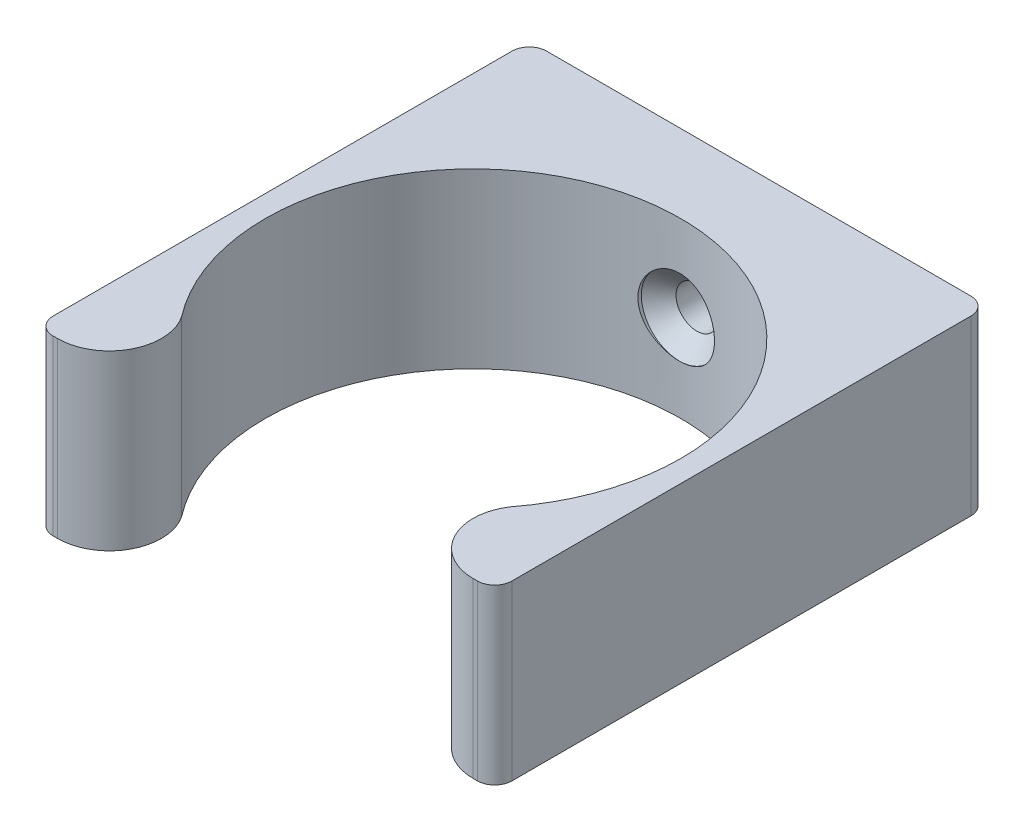
ISO-10303-21;
HEADER;
FILE_DESCRIPTION(('STEP AP214'),'2;1');
FILE_NAME('part.step','',(''),(''),'','','');
FILE_SCHEMA(('AUTOMOTIVE_DESIGN { 1 0 10303 214 1 1 1 1 }'));
ENDSEC;
DATA;
#1=APPLICATION_CONTEXT('core data for automotive mechanical design processes');
#2=APPLICATION_PROTOCOL_DEFINITION('international standard','automotive_design',2000,#1);
#3=PRODUCT_CONTEXT('',#1,'mechanical');
#4=PRODUCT('Part','Part','',(#3));
#5=PRODUCT_RELATED_PRODUCT_CATEGORY('part','',(#4));
#6=PRODUCT_DEFINITION_FORMATION('','',#4);
#7=PRODUCT_DEFINITION_CONTEXT('part definition',#1,'design');
#8=PRODUCT_DEFINITION('design','',#6,#7);
#9=PRODUCT_DEFINITION_SHAPE('','',#8);
#10=(LENGTH_UNIT() NAMED_UNIT(*) SI_UNIT(.MILLI.,.METRE.));
#11=(NAMED_UNIT(*) PLANE_ANGLE_UNIT() SI_UNIT($,.RADIAN.));
#12=(NAMED_UNIT(*) SI_UNIT($,.STERADIAN.) SOLID_ANGLE_UNIT());
#13=UNCERTAINTY_MEASURE_WITH_UNIT(LENGTH_MEASURE(1.E-05),#10,'distance_accuracy_value','');
#14=(GEOMETRIC_REPRESENTATION_CONTEXT(3) GLOBAL_UNCERTAINTY_ASSIGNED_CONTEXT((#13)) GLOBAL_UNIT_ASSIGNED_CONTEXT((#10,
#11,#12)) REPRESENTATION_CONTEXT('',''));
#15=CARTESIAN_POINT('',(0.,0.,0.));
#16=DIRECTION('',(0.,0.,1.));
#17=DIRECTION('',(1.,0.,0.));
#18=AXIS2_PLACEMENT_3D('',#15,#16,#17);
#19=CARTESIAN_POINT('',(12.,10.,8.99688248633757));
#20=DIRECTION('',(0.,-1.,0.));
#21=DIRECTION('',(0.,0.,-1.));
#22=AXIS2_PLACEMENT_3D('',#19,#20,#21);
#23=CYLINDRICAL_SURFACE('',#22,3.00311751366243);
#24=CARTESIAN_POINT('',(12.,0.,8.99688248633757));
#25=DIRECTION('',(0.,-1.,0.));
#26=DIRECTION('',(0.,0.,-1.));
#27=AXIS2_PLACEMENT_3D('',#24,#25,#26);
#28=CIRCLE('',#27,3.00311751366243);
#29=CARTESIAN_POINT('',(12.,0.,12.));
#30=VERTEX_POINT('',#29);
#31=CARTESIAN_POINT('',(9.5075675424474,0.,7.32162273173105));
#32=VERTEX_POINT('',#31);
#33=EDGE_CURVE('E156',#30,#32,#28,.T.);
#34=ORIENTED_EDGE('',*,*,#33,.F.);
#35=DIRECTION('',(0.,-1.,0.));
#36=VECTOR('',#35,1.);
#37=CARTESIAN_POINT('',(12.,10.,12.));
#38=LINE('',#37,#36);
#39=CARTESIAN_POINT('',(12.,10.,12.));
#40=VERTEX_POINT('',#39);
#41=EDGE_CURVE('E11',#40,#30,#38,.T.);
#42=ORIENTED_EDGE('',*,*,#41,.F.);
#43=CARTESIAN_POINT('',(12.,10.,8.99688248633757));
#44=DIRECTION('',(0.,-1.,0.));
#45=DIRECTION('',(0.,0.,-1.));
#46=AXIS2_PLACEMENT_3D('',#43,#44,#45);
#47=CIRCLE('',#46,3.00311751366243);
#48=CARTESIAN_POINT('',(9.5075675424474,10.,7.32162273173105));
#49=VERTEX_POINT('',#48);
#50=EDGE_CURVE('E188',#40,#49,#47,.T.);
#51=ORIENTED_EDGE('',*,*,#50,.T.);
#52=DIRECTION('',(0.,-1.,0.));
#53=VECTOR('',#52,1.);
#54=CARTESIAN_POINT('',(9.5075675424474,10.,7.32162273173105));
#55=LINE('',#54,#53);
#56=EDGE_CURVE('E102',#49,#32,#55,.T.);
#57=ORIENTED_EDGE('',*,*,#56,.T.);
#58=EDGE_LOOP('',(#34,#42,#51,#57));
#59=FACE_BOUND('',#58,.T.);
#60=ADVANCED_FACE('F33',(#59),#23,.T.);
#61=CARTESIAN_POINT('',(12.25,10.,12.));
#62=DIRECTION('',(0.,0.,1.));
#63=DIRECTION('',(1.,0.,0.));
#64=AXIS2_PLACEMENT_3D('',#61,#62,#63);
#65=PLANE('',#64);
#66=DIRECTION('',(-1.,0.,0.));
#67=VECTOR('',#66,1.);
#68=CARTESIAN_POINT('',(12.25,0.,12.));
#69=LINE('',#68,#67);
#70=CARTESIAN_POINT('',(12.25,0.,12.));
#71=VERTEX_POINT('',#70);
#72=EDGE_CURVE('E186',#71,#30,#69,.T.);
#73=ORIENTED_EDGE('',*,*,#72,.F.);
#74=DIRECTION('',(0.,-1.,0.));
#75=VECTOR('',#74,1.);
#76=CARTESIAN_POINT('',(12.25,10.,12.));
#77=LINE('',#76,#75);
#78=CARTESIAN_POINT('',(12.25,10.,12.));
#79=VERTEX_POINT('',#78);
#80=EDGE_CURVE('E42',#79,#71,#77,.T.);
#81=ORIENTED_EDGE('',*,*,#80,.F.);
#82=DIRECTION('',(-1.,0.,0.));
#83=VECTOR('',#82,1.);
#84=CARTESIAN_POINT('',(12.25,10.,12.));
#85=LINE('',#84,#83);
#86=EDGE_CURVE('E151',#79,#40,#85,.T.);
#87=ORIENTED_EDGE('',*,*,#86,.T.);
#88=ORIENTED_EDGE('',*,*,#41,.T.);
#89=EDGE_LOOP('',(#73,#81,#87,#88));
#90=FACE_BOUND('',#89,.T.);
#91=ADVANCED_FACE('F211',(#90),#65,.T.);
#92=CARTESIAN_POINT('',(12.25,10.,11.));
#93=DIRECTION('',(0.,-1.,0.));
#94=DIRECTION('',(0.,0.,-1.));
#95=AXIS2_PLACEMENT_3D('',#92,#93,#94);
#96=CYLINDRICAL_SURFACE('',#95,0.999999999999999);
#97=CARTESIAN_POINT('',(12.25,0.,11.));
#98=DIRECTION('',(0.,-1.,0.));
#99=DIRECTION('',(0.,0.,-1.));
#100=AXIS2_PLACEMENT_3D('',#97,#98,#99);
#101=CIRCLE('',#100,0.999999999999999);
#102=CARTESIAN_POINT('',(13.25,0.,11.));
#103=VERTEX_POINT('',#102);
#104=EDGE_CURVE('E136',#103,#71,#101,.T.);
#105=ORIENTED_EDGE('',*,*,#104,.F.);
#106=DIRECTION('',(0.,-1.,0.));
#107=VECTOR('',#106,1.);
#108=CARTESIAN_POINT('',(13.25,10.,11.));
#109=LINE('',#108,#107);
#110=CARTESIAN_POINT('',(13.25,10.,11.));
#111=VERTEX_POINT('',#110);
#112=EDGE_CURVE('E130',#111,#103,#109,.T.);
#113=ORIENTED_EDGE('',*,*,#112,.F.);
#114=CARTESIAN_POINT('',(12.25,10.,11.));
#115=DIRECTION('',(0.,-1.,0.));
#116=DIRECTION('',(0.,0.,-1.));
#117=AXIS2_PLACEMENT_3D('',#114,#115,#116);
#118=CIRCLE('',#117,0.999999999999999);
#119=EDGE_CURVE('E134',#111,#79,#118,.T.);
#120=ORIENTED_EDGE('',*,*,#119,.T.);
#121=ORIENTED_EDGE('',*,*,#80,.T.);
#122=EDGE_LOOP('',(#105,#113,#120,#121));
#123=FACE_BOUND('',#122,.T.);
#124=ADVANCED_FACE('F132',(#123),#96,.T.);
#125=CARTESIAN_POINT('',(13.25,10.,11.));
#126=DIRECTION('',(-1.,0.,0.));
#127=DIRECTION('',(0.,0.,1.));
#128=AXIS2_PLACEMENT_3D('',#125,#126,#127);
#129=PLANE('',#128);
#130=DIRECTION('',(0.,0.,-1.));
#131=VECTOR('',#130,1.);
#132=CARTESIAN_POINT('',(13.25,0.,11.));
#133=LINE('',#132,#131);
#134=CARTESIAN_POINT('',(13.25,0.,-15.5));
#135=VERTEX_POINT('',#134);
#136=EDGE_CURVE('E183',#103,#135,#133,.T.);
#137=ORIENTED_EDGE('',*,*,#136,.T.);
#138=DIRECTION('',(0.,-1.,0.));
#139=VECTOR('',#138,1.);
#140=CARTESIAN_POINT('',(13.25,10.,-15.5));
#141=LINE('',#140,#139);
#142=CARTESIAN_POINT('',(13.25,10.,-15.5));
#143=VERTEX_POINT('',#142);
#144=EDGE_CURVE('E140',#143,#135,#141,.T.);
#145=ORIENTED_EDGE('',*,*,#144,.F.);
#146=DIRECTION('',(0.,0.,-1.));
#147=VECTOR('',#146,1.);
#148=CARTESIAN_POINT('',(13.25,10.,11.));
#149=LINE('',#148,#147);
#150=EDGE_CURVE('E143',#111,#143,#149,.T.);
#151=ORIENTED_EDGE('',*,*,#150,.F.);
#152=ORIENTED_EDGE('',*,*,#112,.T.);
#153=EDGE_LOOP('',(#137,#145,#151,#152));
#154=FACE_BOUND('',#153,.T.);
#155=ADVANCED_FACE('F144',(#154),#129,.F.);
#156=CARTESIAN_POINT('',(12.25,10.,-15.5));
#157=DIRECTION('',(0.,-1.,0.));
#158=DIRECTION('',(0.,0.,-1.));
#159=AXIS2_PLACEMENT_3D('',#156,#157,#158);
#160=CYLINDRICAL_SURFACE('',#159,1.);
#161=CARTESIAN_POINT('',(12.25,0.,-15.5));
#162=DIRECTION('',(0.,-1.,0.));
#163=DIRECTION('',(0.,0.,-1.));
#164=AXIS2_PLACEMENT_3D('',#161,#162,#163);
#165=CIRCLE('',#164,1.);
#166=CARTESIAN_POINT('',(12.25,0.,-16.5));
#167=VERTEX_POINT('',#166);
#168=EDGE_CURVE('E180',#167,#135,#165,.T.);
#169=ORIENTED_EDGE('',*,*,#168,.F.);
#170=DIRECTION('',(0.,-1.,0.));
#171=VECTOR('',#170,1.);
#172=CARTESIAN_POINT('',(12.25,10.,-16.5));
#173=LINE('',#172,#171);
#174=CARTESIAN_POINT('',(12.25,10.,-16.5));
#175=VERTEX_POINT('',#174);
#176=EDGE_CURVE('E192',#175,#167,#173,.T.);
#177=ORIENTED_EDGE('',*,*,#176,.F.);
#178=CARTESIAN_POINT('',(12.25,10.,-15.5));
#179=DIRECTION('',(0.,-1.,0.));
#180=DIRECTION('',(0.,0.,-1.));
#181=AXIS2_PLACEMENT_3D('',#178,#179,#180);
#182=CIRCLE('',#181,1.);
#183=EDGE_CURVE('E148',#175,#143,#182,.T.);
#184=ORIENTED_EDGE('',*,*,#183,.T.);
#185=ORIENTED_EDGE('',*,*,#144,.T.);
#186=EDGE_LOOP('',(#169,#177,#184,#185));
#187=FACE_BOUND('',#186,.T.);
#188=ADVANCED_FACE('F224',(#187),#160,.T.);
#189=CARTESIAN_POINT('',(12.25,10.,-16.5));
#190=DIRECTION('',(0.,0.,1.));
#191=DIRECTION('',(1.,0.,0.));
#192=AXIS2_PLACEMENT_3D('',#189,#190,#191);
#193=PLANE('',#192);
#194=CARTESIAN_POINT('',(-0.0908605804392922,5.03144543899481,-16.5));
#195=DIRECTION('',(0.,0.,1.));
#196=DIRECTION('',(1.,0.,0.));
#197=AXIS2_PLACEMENT_3D('',#194,#195,#196);
#198=ELLIPSE('',#197,1.2000181941212,1.2);
#199=CARTESIAN_POINT('',(1.1091576136819,5.03144543899481,-16.5));
#200=VERTEX_POINT('',#199);
#201=EDGE_CURVE('E36',#200,#200,#198,.T.);
#202=ORIENTED_EDGE('',*,*,#201,.T.);
#203=EDGE_LOOP('',(#202));
#204=FACE_BOUND('',#203,.T.);
#205=DIRECTION('',(-1.,0.,0.));
#206=VECTOR('',#205,1.);
#207=CARTESIAN_POINT('',(12.25,0.,-16.5));
#208=LINE('',#207,#206);
#209=CARTESIAN_POINT('',(-12.25,0.,-16.5));
#210=VERTEX_POINT('',#209);
#211=EDGE_CURVE('E178',#167,#210,#208,.T.);
#212=ORIENTED_EDGE('',*,*,#211,.T.);
#213=DIRECTION('',(0.,-1.,0.));
#214=VECTOR('',#213,1.);
#215=CARTESIAN_POINT('',(-12.25,10.,-16.5));
#216=LINE('',#215,#214);
#217=CARTESIAN_POINT('',(-12.25,10.,-16.5));
#218=VERTEX_POINT('',#217);
#219=EDGE_CURVE('E194',#218,#210,#216,.T.);
#220=ORIENTED_EDGE('',*,*,#219,.F.);
#221=DIRECTION('',(-1.,0.,0.));
#222=VECTOR('',#221,1.);
#223=CARTESIAN_POINT('',(12.25,10.,-16.5));
#224=LINE('',#223,#222);
#225=EDGE_CURVE('E424',#175,#218,#224,.T.);
#226=ORIENTED_EDGE('',*,*,#225,.F.);
#227=ORIENTED_EDGE('',*,*,#176,.T.);
#228=EDGE_LOOP('',(#212,#220,#226,#227));
#229=FACE_BOUND('',#228,.T.);
#230=ADVANCED_FACE('F227',(#204,#229),#193,.F.);
#231=CARTESIAN_POINT('',(-12.25,10.,-15.5));
#232=DIRECTION('',(0.,-1.,0.));
#233=DIRECTION('',(0.,0.,-1.));
#234=AXIS2_PLACEMENT_3D('',#231,#232,#233);
#235=CYLINDRICAL_SURFACE('',#234,1.);
#236=CARTESIAN_POINT('',(-12.25,0.,-15.5));
#237=DIRECTION('',(0.,1.,0.));
#238=DIRECTION('',(0.,0.,1.));
#239=AXIS2_PLACEMENT_3D('',#236,#237,#238);
#240=CIRCLE('',#239,1.);
#241=CARTESIAN_POINT('',(-13.25,0.,-15.5));
#242=VERTEX_POINT('',#241);
#243=EDGE_CURVE('E175',#210,#242,#240,.T.);
#244=ORIENTED_EDGE('',*,*,#243,.T.);
#245=DIRECTION('',(0.,-1.,0.));
#246=VECTOR('',#245,1.);
#247=CARTESIAN_POINT('',(-13.25,10.,-15.5));
#248=LINE('',#247,#246);
#249=CARTESIAN_POINT('',(-13.25,10.,-15.5));
#250=VERTEX_POINT('',#249);
#251=EDGE_CURVE('E197',#250,#242,#248,.T.);
#252=ORIENTED_EDGE('',*,*,#251,.F.);
#253=CARTESIAN_POINT('',(-12.25,10.,-15.5));
#254=DIRECTION('',(0.,1.,0.));
#255=DIRECTION('',(0.,0.,1.));
#256=AXIS2_PLACEMENT_3D('',#253,#254,#255);
#257=CIRCLE('',#256,1.);
#258=EDGE_CURVE('E415',#218,#250,#257,.T.);
#259=ORIENTED_EDGE('',*,*,#258,.F.);
#260=ORIENTED_EDGE('',*,*,#219,.T.);
#261=EDGE_LOOP('',(#244,#252,#259,#260));
#262=FACE_BOUND('',#261,.T.);
#263=ADVANCED_FACE('F231',(#262),#235,.T.);
#264=CARTESIAN_POINT('',(-13.25,10.,11.));
#265=DIRECTION('',(-1.,0.,0.));
#266=DIRECTION('',(0.,0.,1.));
#267=AXIS2_PLACEMENT_3D('',#264,#265,#266);
#268=PLANE('',#267);
#269=DIRECTION('',(0.,0.,-1.));
#270=VECTOR('',#269,1.);
#271=CARTESIAN_POINT('',(-13.25,0.,11.));
#272=LINE('',#271,#270);
#273=CARTESIAN_POINT('',(-13.25,0.,11.));
#274=VERTEX_POINT('',#273);
#275=EDGE_CURVE('E172',#274,#242,#272,.T.);
#276=ORIENTED_EDGE('',*,*,#275,.F.);
#277=DIRECTION('',(0.,-1.,0.));
#278=VECTOR('',#277,1.);
#279=CARTESIAN_POINT('',(-13.25,10.,11.));
#280=LINE('',#279,#278);
#281=CARTESIAN_POINT('',(-13.25,10.,11.));
#282=VERTEX_POINT('',#281);
#283=EDGE_CURVE('E199',#282,#274,#280,.T.);
#284=ORIENTED_EDGE('',*,*,#283,.F.);
#285=DIRECTION('',(0.,0.,-1.));
#286=VECTOR('',#285,1.);
#287=CARTESIAN_POINT('',(-13.25,10.,11.));
#288=LINE('',#287,#286);
#289=EDGE_CURVE('E421',#282,#250,#288,.T.);
#290=ORIENTED_EDGE('',*,*,#289,.T.);
#291=ORIENTED_EDGE('',*,*,#251,.T.);
#292=EDGE_LOOP('',(#276,#284,#290,#291));
#293=FACE_BOUND('',#292,.T.);
#294=ADVANCED_FACE('F235',(#293),#268,.T.);
#295=CARTESIAN_POINT('',(-12.25,10.,11.));
#296=DIRECTION('',(0.,-1.,0.));
#297=DIRECTION('',(0.,0.,-1.));
#298=AXIS2_PLACEMENT_3D('',#295,#296,#297);
#299=CYLINDRICAL_SURFACE('',#298,0.999999999999999);
#300=CARTESIAN_POINT('',(-12.25,0.,11.));
#301=DIRECTION('',(0.,1.,0.));
#302=DIRECTION('',(0.,0.,1.));
#303=AXIS2_PLACEMENT_3D('',#300,#301,#302);
#304=CIRCLE('',#303,0.999999999999999);
#305=CARTESIAN_POINT('',(-12.25,0.,12.));
#306=VERTEX_POINT('',#305);
#307=EDGE_CURVE('E169',#274,#306,#304,.T.);
#308=ORIENTED_EDGE('',*,*,#307,.T.);
#309=DIRECTION('',(0.,-1.,0.));
#310=VECTOR('',#309,1.);
#311=CARTESIAN_POINT('',(-12.25,10.,12.));
#312=LINE('',#311,#310);
#313=CARTESIAN_POINT('',(-12.25,10.,12.));
#314=VERTEX_POINT('',#313);
#315=EDGE_CURVE('E201',#314,#306,#312,.T.);
#316=ORIENTED_EDGE('',*,*,#315,.F.);
#317=CARTESIAN_POINT('',(-12.25,10.,11.));
#318=DIRECTION('',(0.,1.,0.));
#319=DIRECTION('',(0.,0.,1.));
#320=AXIS2_PLACEMENT_3D('',#317,#318,#319);
#321=CIRCLE('',#320,0.999999999999999);
#322=EDGE_CURVE('E422',#282,#314,#321,.T.);
#323=ORIENTED_EDGE('',*,*,#322,.F.);
#324=ORIENTED_EDGE('',*,*,#283,.T.);
#325=EDGE_LOOP('',(#308,#316,#323,#324));
#326=FACE_BOUND('',#325,.T.);
#327=ADVANCED_FACE('F239',(#326),#299,.T.);
#328=CARTESIAN_POINT('',(-12.,10.,12.));
#329=DIRECTION('',(0.,0.,1.));
#330=DIRECTION('',(1.,0.,0.));
#331=AXIS2_PLACEMENT_3D('',#328,#329,#330);
#332=PLANE('',#331);
#333=DIRECTION('',(-1.,0.,0.));
#334=VECTOR('',#333,1.);
#335=CARTESIAN_POINT('',(-12.,0.,12.));
#336=LINE('',#335,#334);
#337=CARTESIAN_POINT('',(-12.,0.,12.));
#338=VERTEX_POINT('',#337);
#339=EDGE_CURVE('E166',#338,#306,#336,.T.);
#340=ORIENTED_EDGE('',*,*,#339,.F.);
#341=DIRECTION('',(0.,-1.,0.));
#342=VECTOR('',#341,1.);
#343=CARTESIAN_POINT('',(-12.,10.,12.));
#344=LINE('',#343,#342);
#345=CARTESIAN_POINT('',(-12.,10.,12.));
#346=VERTEX_POINT('',#345);
#347=EDGE_CURVE('E203',#346,#338,#344,.T.);
#348=ORIENTED_EDGE('',*,*,#347,.F.);
#349=DIRECTION('',(-1.,0.,0.));
#350=VECTOR('',#349,1.);
#351=CARTESIAN_POINT('',(-12.,10.,12.));
#352=LINE('',#351,#350);
#353=EDGE_CURVE('E426',#346,#314,#352,.T.);
#354=ORIENTED_EDGE('',*,*,#353,.T.);
#355=ORIENTED_EDGE('',*,*,#315,.T.);
#356=EDGE_LOOP('',(#340,#348,#354,#355));
#357=FACE_BOUND('',#356,.T.);
#358=ADVANCED_FACE('F243',(#357),#332,.T.);
#359=CARTESIAN_POINT('',(-12.,10.,8.99688248633757));
#360=DIRECTION('',(0.,-1.,0.));
#361=DIRECTION('',(0.,0.,-1.));
#362=AXIS2_PLACEMENT_3D('',#359,#360,#361);
#363=CYLINDRICAL_SURFACE('',#362,3.00311751366243);
#364=CARTESIAN_POINT('',(-12.,0.,8.99688248633757));
#365=DIRECTION('',(0.,1.,0.));
#366=DIRECTION('',(0.,0.,1.));
#367=AXIS2_PLACEMENT_3D('',#364,#365,#366);
#368=CIRCLE('',#367,3.00311751366243);
#369=CARTESIAN_POINT('',(-9.5075675424474,0.,7.32162273173105));
#370=VERTEX_POINT('',#369);
#371=EDGE_CURVE('E163',#338,#370,#368,.T.);
#372=ORIENTED_EDGE('',*,*,#371,.T.);
#373=DIRECTION('',(0.,-1.,0.));
#374=VECTOR('',#373,1.);
#375=CARTESIAN_POINT('',(-9.5075675424474,10.,7.32162273173105));
#376=LINE('',#375,#374);
#377=CARTESIAN_POINT('',(-9.5075675424474,10.,7.32162273173105));
#378=VERTEX_POINT('',#377);
#379=EDGE_CURVE('E205',#378,#370,#376,.T.);
#380=ORIENTED_EDGE('',*,*,#379,.F.);
#381=CARTESIAN_POINT('',(-12.,10.,8.99688248633757));
#382=DIRECTION('',(0.,1.,0.));
#383=DIRECTION('',(0.,0.,1.));
#384=AXIS2_PLACEMENT_3D('',#381,#382,#383);
#385=CIRCLE('',#384,3.00311751366243);
#386=EDGE_CURVE('E432',#346,#378,#385,.T.);
#387=ORIENTED_EDGE('',*,*,#386,.F.);
#388=ORIENTED_EDGE('',*,*,#347,.T.);
#389=EDGE_LOOP('',(#372,#380,#387,#388));
#390=FACE_BOUND('',#389,.T.);
#391=ADVANCED_FACE('F247',(#390),#363,.T.);
#392=CARTESIAN_POINT('',(0.,10.,0.));
#393=DIRECTION('',(0.,-1.,0.));
#394=DIRECTION('',(0.,0.,-1.));
#395=AXIS2_PLACEMENT_3D('',#392,#393,#394);
#396=CYLINDRICAL_SURFACE('',#395,12.);
#397=CARTESIAN_POINT('',(-0.0660794202568555,2.83144543899481,-11.9998180615465));
#398=CARTESIAN_POINT('',(0.0563938551895709,2.83145017073965,-12.0004902861379));
#399=CARTESIAN_POINT('',(0.178939678423516,2.8417073764427,-11.9992728650797));
#400=CARTESIAN_POINT('',(0.420601460862065,2.88244073101357,-11.9932374346969));
#401=CARTESIAN_POINT('',(0.53971437917587,2.91293426376486,-11.9884163292006));
#402=CARTESIAN_POINT('',(0.770977368449362,2.9931779771731,-11.975767094081));
#403=CARTESIAN_POINT('',(0.883133502941303,3.04291110695796,-11.9679416270849));
#404=CARTESIAN_POINT('',(1.09751051895816,3.16017463466504,-11.9501906004965));
#405=CARTESIAN_POINT('',(1.19973227236349,3.22770346883192,-11.9402652254437));
#406=CARTESIAN_POINT('',(1.3925180546189,3.37946425128086,-11.9193290610292));
#407=CARTESIAN_POINT('',(1.48295151750279,3.46386068433227,-11.9083081675077));
#408=CARTESIAN_POINT('',(1.64845828347692,3.64660707299149,-11.8865289336432));
#409=CARTESIAN_POINT('',(1.72353051238422,3.74495800359796,-11.8757706117077));
#410=CARTESIAN_POINT('',(1.85671824202733,3.95373933110354,-11.8556815006806));
#411=CARTESIAN_POINT('',(1.91470157398014,4.06425524334681,-11.8463620909519));
#412=CARTESIAN_POINT('',(2.01121487386102,4.2936568169396,-11.8303602342477));
#413=CARTESIAN_POINT('',(2.04974644244372,4.4125417886949,-11.8236775703085));
#414=CARTESIAN_POINT('',(2.10584108410117,4.65391176746714,-11.8138157872128));
#415=CARTESIAN_POINT('',(2.12363170293542,4.77634230799418,-11.8105986783263));
#416=CARTESIAN_POINT('',(2.13844399563416,5.02248904400838,-11.8079260593959));
#417=CARTESIAN_POINT('',(2.13546744925066,5.14620512841672,-11.8084702270094));
#418=CARTESIAN_POINT('',(2.10901487086032,5.38976920081468,-11.8132225584491));
#419=CARTESIAN_POINT('',(2.08579694141259,5.50964626132319,-11.8173845881351));
#420=CARTESIAN_POINT('',(2.01992883422541,5.7437781757224,-11.8288205171384));
#421=CARTESIAN_POINT('',(1.97727786373615,5.85803280004122,-11.8360945434055));
#422=CARTESIAN_POINT('',(1.87350350741609,6.07843465568595,-11.8529637485411));
#423=CARTESIAN_POINT('',(1.81227531820519,6.18453149345728,-11.8625720331835));
#424=CARTESIAN_POINT('',(1.67316335993806,6.38505154741145,-11.882990020109));
#425=CARTESIAN_POINT('',(1.59527797249421,6.47947362788514,-11.8937998390821));
#426=CARTESIAN_POINT('',(1.42367333526816,6.65545422003157,-11.91556668233));
#427=CARTESIAN_POINT('',(1.32973339442441,6.73679771012013,-11.9265234731619));
#428=CARTESIAN_POINT('',(1.12943254499543,6.88261304944802,-11.9471545611709));
#429=CARTESIAN_POINT('',(1.02307152204927,6.94708474333097,-11.9568288465382));
#430=CARTESIAN_POINT('',(0.800732703195348,7.05735550370162,-11.9737736976754));
#431=CARTESIAN_POINT('',(0.684743939156911,7.10313291198305,-11.9810414735585));
#432=CARTESIAN_POINT('',(0.446563585839071,7.17450200182706,-11.9922800169931));
#433=CARTESIAN_POINT('',(0.324372627419788,7.20009573202339,-11.9962511191576));
#434=CARTESIAN_POINT('',(0.0791094220272523,7.23007329856966,-12.0003570851132));
#435=CARTESIAN_POINT('',(-0.0439259457489456,7.23475186404176,-12.000545388141));
#436=CARTESIAN_POINT('',(-0.289000440865115,7.22355586713319,-11.997145334535));
#437=CARTESIAN_POINT('',(-0.411039614645885,7.20768226842829,-11.9935571549791));
#438=CARTESIAN_POINT('',(-0.6497292944511,7.15607760648212,-11.982989092396));
#439=CARTESIAN_POINT('',(-0.766413108949756,7.12049500453055,-11.9760346153595));
#440=CARTESIAN_POINT('',(-0.992143635905995,7.03064255185961,-11.95945113654));
#441=CARTESIAN_POINT('',(-1.1011898472451,6.97637147633158,-11.9498219594702));
#442=CARTESIAN_POINT('',(-1.30981562882352,6.85002558055403,-11.9287679083996));
#443=CARTESIAN_POINT('',(-1.40928379424572,6.77776982883504,-11.9173252435372));
#444=CARTESIAN_POINT('',(-1.59478487069321,6.61775132691117,-11.8939235994827));
#445=CARTESIAN_POINT('',(-1.68081658475128,6.52998719664707,-11.8819645744123));
#446=CARTESIAN_POINT('',(-1.83812121236666,6.34011145098946,-11.8586562723647));
#447=CARTESIAN_POINT('',(-1.90919344530547,6.23783223036803,-11.8473166339855));
#448=CARTESIAN_POINT('',(-2.03315837620902,6.02260313228845,-11.8266746249639));
#449=CARTESIAN_POINT('',(-2.08605173097748,5.90965364053572,-11.8173721807221));
#450=CARTESIAN_POINT('',(-2.17187415139015,5.67681058964078,-11.8019010320194));
#451=CARTESIAN_POINT('',(-2.20489678787728,5.55695253600401,-11.7957176625281));
#452=CARTESIAN_POINT('',(-2.25033314932705,5.31326388727386,-11.7871347147443));
#453=CARTESIAN_POINT('',(-2.26274908591812,5.18943371994465,-11.7847347303987));
#454=CARTESIAN_POINT('',(-2.26654927488794,4.94332521391593,-11.7840042352133));
#455=CARTESIAN_POINT('',(-2.25824967263326,4.82105182575055,-11.7856125520573));
#456=CARTESIAN_POINT('',(-2.22154400976892,4.57967571327938,-11.7925860347085));
#457=CARTESIAN_POINT('',(-2.19313805694358,4.46057297198023,-11.7979511803765));
#458=CARTESIAN_POINT('',(-2.11715449745912,4.2290793103864,-11.8118217567504));
#459=CARTESIAN_POINT('',(-2.06960967282025,4.11667728881863,-11.8203218157437));
#460=CARTESIAN_POINT('',(-1.95672832024206,3.90140240205104,-11.8395303051443));
#461=CARTESIAN_POINT('',(-1.89139061212848,3.79853016955408,-11.8502388820277));
#462=CARTESIAN_POINT('',(-1.74366802351267,3.60364682118427,-11.8728795765748));
#463=CARTESIAN_POINT('',(-1.66105235848092,3.51181239298823,-11.8848270234835));
#464=CARTESIAN_POINT('',(-1.48159579296865,3.3432149505436,-11.9085284058903));
#465=CARTESIAN_POINT('',(-1.38475162749806,3.26645540497498,-11.9202822962829));
#466=CARTESIAN_POINT('',(-1.17859108953514,3.12957594436331,-11.9424349572075));
#467=CARTESIAN_POINT('',(-1.06917514912066,3.06960392624421,-11.9528212807724));
#468=CARTESIAN_POINT('',(-0.841664840236016,2.96899771798948,-11.970988838812));
#469=CARTESIAN_POINT('',(-0.723578851032013,2.92834513314247,-11.9787725492241));
#470=CARTESIAN_POINT('',(-0.515283534233982,2.87590605292943,-11.9892539190937));
#471=CARTESIAN_POINT('',(-0.426306166488524,2.85926143544709,-11.9927608921237));
#472=CARTESIAN_POINT('',(-0.24692550451106,2.83702951154367,-11.9977947312335));
#473=CARTESIAN_POINT('',(-0.15652224390746,2.83144194474381,-11.9993216439407));
#474=CARTESIAN_POINT('',(-0.0660794202568555,2.83144543899481,-11.9998180615465));
#475=B_SPLINE_CURVE_WITH_KNOTS('',3,(#397,#398,#399,#400,#401,#402,#403,#404,#405,#406,#407,
#408,#409,#410,#411,#412,#413,#414,#415,#416,#417,#418,#419,#420,#421,#422,#423,#424,#425,#426,
#427,#428,#429,#430,#431,#432,#433,#434,#435,#436,#437,#438,#439,#440,#441,#442,#443,#444,#445,
#446,#447,#448,#449,#450,#451,#452,#453,#454,#455,#456,#457,#458,#459,#460,#461,#462,#463,#464,
#465,#466,#467,#468,#469,#470,#471,#472,#473,#474),.UNSPECIFIED.,.T.,.F.,(4,2,2,2,2,2,2,2,2,2,2,
2,2,2,2,2,2,2,2,2,2,2,2,2,2,2,2,2,2,2,2,2,2,2,2,2,2,2,4),(0.,0.367094634844024,
0.734505028834652,1.10159055277336,1.46864383069134,1.83946833348518,2.21031875850161,
2.5839663608528,2.95758321132375,3.32706140475319,3.69650793418431,4.06131135184956,
4.42612965260667,4.79304560056121,5.15999721370999,5.53247233731714,5.90495089057389,
6.27785976173896,6.65073077795733,7.01833051876931,7.38591302372578,7.75076358523902,
8.11563806294858,8.48434318701482,8.85308113794235,9.22648830014423,9.59988196970919,
9.97150328798754,10.3430847191692,10.7090301238623,11.0749735668429,11.4402928526508,
11.8056363754224,12.1762132383238,12.5468752700727,12.9207068084085,13.2941816919134,
13.5652764027384,13.8363647295694),.UNSPECIFIED.);
#476=CARTESIAN_POINT('',(-0.0660794202568555,7.23144543899481,-11.9998180615465));
#477=VERTEX_POINT('',#476);
#478=CARTESIAN_POINT('',(-0.0660794202568555,2.83144543899481,-11.9998180615465));
#479=VERTEX_POINT('',#478);
#480=EDGE_CURVE('E259',#477,#479,#475,.T.);
#481=ORIENTED_EDGE('',*,*,#480,.F.);
#482=EDGE_CURVE('E160',#479,#477,#475,.T.);
#483=ORIENTED_EDGE('',*,*,#482,.F.);
#484=EDGE_LOOP('',(#481,#483));
#485=FACE_BOUND('',#484,.T.);
#486=CARTESIAN_POINT('',(0.,0.,0.));
#487=DIRECTION('',(0.,1.,0.));
#488=DIRECTION('',(0.,0.,1.));
#489=AXIS2_PLACEMENT_3D('',#486,#487,#488);
#490=CIRCLE('',#489,12.);
#491=EDGE_CURVE('E159',#32,#370,#490,.T.);
#492=ORIENTED_EDGE('',*,*,#491,.F.);
#493=ORIENTED_EDGE('',*,*,#56,.F.);
#494=CARTESIAN_POINT('',(0.,10.,0.));
#495=DIRECTION('',(0.,1.,0.));
#496=DIRECTION('',(0.,0.,1.));
#497=AXIS2_PLACEMENT_3D('',#494,#495,#496);
#498=CIRCLE('',#497,12.);
#499=EDGE_CURVE('E433',#49,#378,#498,.T.);
#500=ORIENTED_EDGE('',*,*,#499,.T.);
#501=ORIENTED_EDGE('',*,*,#379,.T.);
#502=EDGE_LOOP('',(#492,#493,#500,#501));
#503=FACE_BOUND('',#502,.T.);
#504=ADVANCED_FACE('F206',(#485,#503),#396,.F.);
#505=CARTESIAN_POINT('',(12.,10.,8.99688248633757));
#506=DIRECTION('',(0.,-1.,0.));
#507=DIRECTION('',(0.,0.,-1.));
#508=AXIS2_PLACEMENT_3D('',#505,#506,#507);
#509=PLANE('',#508);
#510=ORIENTED_EDGE('',*,*,#50,.F.);
#511=ORIENTED_EDGE('',*,*,#86,.F.);
#512=ORIENTED_EDGE('',*,*,#119,.F.);
#513=ORIENTED_EDGE('',*,*,#150,.T.);
#514=ORIENTED_EDGE('',*,*,#183,.F.);
#515=ORIENTED_EDGE('',*,*,#225,.T.);
#516=ORIENTED_EDGE('',*,*,#258,.T.);
#517=ORIENTED_EDGE('',*,*,#289,.F.);
#518=ORIENTED_EDGE('',*,*,#322,.T.);
#519=ORIENTED_EDGE('',*,*,#353,.F.);
#520=ORIENTED_EDGE('',*,*,#386,.T.);
#521=ORIENTED_EDGE('',*,*,#499,.F.);
#522=EDGE_LOOP('',(#510,#511,#512,#513,#514,#515,#516,#517,#518,#519,#520,#521));
#523=FACE_BOUND('',#522,.T.);
#524=ADVANCED_FACE('F150',(#523),#509,.F.);
#525=CARTESIAN_POINT('',(12.,0.,8.99688248633757));
#526=DIRECTION('',(0.,-1.,0.));
#527=DIRECTION('',(0.,0.,-1.));
#528=AXIS2_PLACEMENT_3D('',#525,#526,#527);
#529=PLANE('',#528);
#530=ORIENTED_EDGE('',*,*,#33,.T.);
#531=ORIENTED_EDGE('',*,*,#491,.T.);
#532=ORIENTED_EDGE('',*,*,#371,.F.);
#533=ORIENTED_EDGE('',*,*,#339,.T.);
#534=ORIENTED_EDGE('',*,*,#307,.F.);
#535=ORIENTED_EDGE('',*,*,#275,.T.);
#536=ORIENTED_EDGE('',*,*,#243,.F.);
#537=ORIENTED_EDGE('',*,*,#211,.F.);
#538=ORIENTED_EDGE('',*,*,#168,.T.);
#539=ORIENTED_EDGE('',*,*,#136,.F.);
#540=ORIENTED_EDGE('',*,*,#104,.T.);
#541=ORIENTED_EDGE('',*,*,#72,.T.);
#542=EDGE_LOOP('',(#530,#531,#532,#533,#534,#535,#536,#537,#538,#539,#540,#541));
#543=FACE_BOUND('',#542,.T.);
#544=ADVANCED_FACE('F210',(#543),#529,.T.);
#545=CARTESIAN_POINT('',(-0.0660794202568476,5.03144543899481,-11.9998180615465));
#546=DIRECTION('',(0.00550661835473796,0.,0.999984838462212));
#547=DIRECTION('',(0.999984838462212,0.,-0.00550661835473796));
#548=AXIS2_PLACEMENT_3D('',#545,#546,#547);
#549=CYLINDRICAL_SURFACE('',#548,2.2);
#550=ORIENTED_EDGE('',*,*,#482,.T.);
#551=CARTESIAN_POINT('',(-0.0660794202568476,5.03144543899481,-11.9998180615465));
#552=DIRECTION('',(0.00550661835473796,0.,0.999984838462212));
#553=DIRECTION('',(0.999984838462212,0.,-0.00550661835473796));
#554=AXIS2_PLACEMENT_3D('',#551,#552,#553);
#555=CIRCLE('',#554,2.2);
#556=EDGE_CURVE('E265',#479,#477,#555,.T.);
#557=ORIENTED_EDGE('',*,*,#556,.F.);
#558=EDGE_LOOP('',(#550,#557));
#559=FACE_BOUND('',#558,.T.);
#560=ADVANCED_FACE('F282',(#559),#549,.F.);
#561=ORIENTED_EDGE('',*,*,#480,.T.);
#562=CARTESIAN_POINT('',(-0.0660794202568476,5.03144543899481,-11.9998180615465));
#563=DIRECTION('',(0.00550661835473796,0.,0.999984838462212));
#564=DIRECTION('',(0.999984838462212,0.,-0.00550661835473796));
#565=AXIS2_PLACEMENT_3D('',#562,#563,#564);
#566=CIRCLE('',#565,2.2);
#567=EDGE_CURVE('E296',#477,#479,#566,.T.);
#568=ORIENTED_EDGE('',*,*,#567,.F.);
#569=EDGE_LOOP('',(#561,#568));
#570=FACE_BOUND('',#569,.T.);
#571=ADVANCED_FACE('F277',(#570),#549,.F.);
#572=CARTESIAN_POINT('',(-0.0660794202568476,5.03144543899481,-11.9998180615465));
#573=DIRECTION('',(0.00550661835473796,0.,0.999984838462212));
#574=DIRECTION('',(0.999984838462212,0.,-0.00550661835473796));
#575=AXIS2_PLACEMENT_3D('',#572,#573,#574);
#576=CYLINDRICAL_SURFACE('',#575,1.2);
#577=CARTESIAN_POINT('',(-0.0715860386115855,5.03144543899481,-12.9998029000087));
#578=DIRECTION('',(0.00550661835473796,0.,0.999984838462212));
#579=DIRECTION('',(0.999984838462212,0.,-0.00550661835473796));
#580=AXIS2_PLACEMENT_3D('',#577,#578,#579);
#581=CIRCLE('',#580,1.2);
#582=CARTESIAN_POINT('',(1.12839576754307,5.03144543899481,-13.0064108420344));
#583=VERTEX_POINT('',#582);
#584=EDGE_CURVE('E294',#583,#583,#581,.T.);
#585=ORIENTED_EDGE('',*,*,#584,.T.);
#586=EDGE_LOOP('',(#585));
#587=FACE_BOUND('',#586,.T.);
#588=ORIENTED_EDGE('',*,*,#201,.F.);
#589=EDGE_LOOP('',(#588));
#590=FACE_BOUND('',#589,.T.);
#591=ADVANCED_FACE('F281',(#587,#590),#576,.F.);
#592=CARTESIAN_POINT('',(-0.0660794202568476,5.03144543899481,-11.9998180615465));
#593=DIRECTION('',(0.00550661835473796,0.,0.999984838462212));
#594=DIRECTION('',(0.999984838462212,0.,-0.00550661835473796));
#595=AXIS2_PLACEMENT_3D('',#592,#593,#594);
#596=CONICAL_SURFACE('',#595,2.2,0.785398163397448);
#597=ORIENTED_EDGE('',*,*,#584,.F.);
#598=EDGE_LOOP('',(#597));
#599=FACE_BOUND('',#598,.T.);
#600=ORIENTED_EDGE('',*,*,#567,.T.);
#601=ORIENTED_EDGE('',*,*,#556,.T.);
#602=EDGE_LOOP('',(#600,#601));
#603=FACE_BOUND('',#602,.T.);
#604=ADVANCED_FACE('F285',(#599,#603),#596,.F.);
#605=CLOSED_SHELL('',(#60,#91,#124,#155,#188,#230,#263,#294,#327,#358,#391,#504,#524,#544,#560,
#571,#591,#604));
#606=MANIFOLD_SOLID_BREP('B2',#605);
#607=ADVANCED_BREP_SHAPE_REPRESENTATION('',(#18,#606),#14);
#608=SHAPE_DEFINITION_REPRESENTATION(#9,#607);
ENDSEC;
END-ISO-10303-21;
